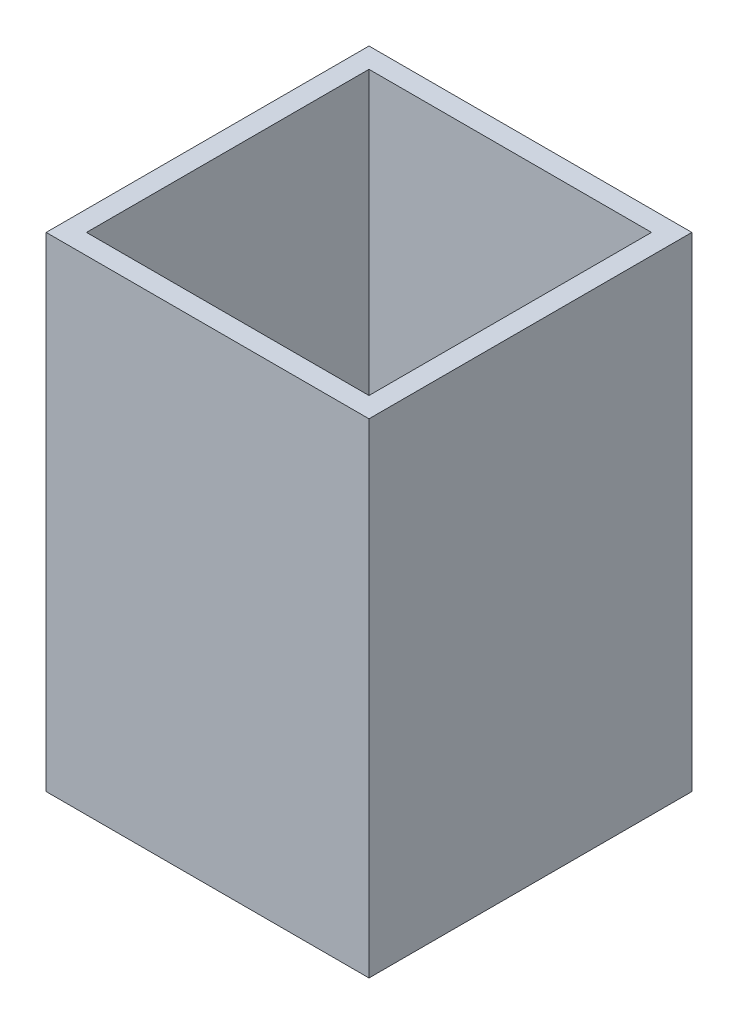
ISO-10303-21;
HEADER;
FILE_DESCRIPTION(('STEP AP214'),'2;1');
FILE_NAME('part.step','',(''),(''),'','','');
FILE_SCHEMA(('AUTOMOTIVE_DESIGN { 1 0 10303 214 1 1 1 1 }'));
ENDSEC;
DATA;
#1=APPLICATION_CONTEXT('core data for automotive mechanical design processes');
#2=APPLICATION_PROTOCOL_DEFINITION('international standard','automotive_design',2000,#1);
#3=PRODUCT_CONTEXT('',#1,'mechanical');
#4=PRODUCT('Part','Part','',(#3));
#5=PRODUCT_RELATED_PRODUCT_CATEGORY('part','',(#4));
#6=PRODUCT_DEFINITION_FORMATION('','',#4);
#7=PRODUCT_DEFINITION_CONTEXT('part definition',#1,'design');
#8=PRODUCT_DEFINITION('design','',#6,#7);
#9=PRODUCT_DEFINITION_SHAPE('','',#8);
#10=(LENGTH_UNIT() NAMED_UNIT(*) SI_UNIT(.MILLI.,.METRE.));
#11=(NAMED_UNIT(*) PLANE_ANGLE_UNIT() SI_UNIT($,.RADIAN.));
#12=(NAMED_UNIT(*) SI_UNIT($,.STERADIAN.) SOLID_ANGLE_UNIT());
#13=UNCERTAINTY_MEASURE_WITH_UNIT(LENGTH_MEASURE(1.E-05),#10,'distance_accuracy_value','');
#14=(GEOMETRIC_REPRESENTATION_CONTEXT(3) GLOBAL_UNCERTAINTY_ASSIGNED_CONTEXT((#13)) GLOBAL_UNIT_ASSIGNED_CONTEXT((#10,
#11,#12)) REPRESENTATION_CONTEXT('',''));
#15=CARTESIAN_POINT('',(0.,0.,0.));
#16=DIRECTION('',(0.,0.,1.));
#17=DIRECTION('',(1.,0.,0.));
#18=AXIS2_PLACEMENT_3D('',#15,#16,#17);
#19=CARTESIAN_POINT('',(90.3275482081614,76.2,23.5625298061409));
#20=DIRECTION('',(0.,-1.,0.));
#21=DIRECTION('',(0.,0.,-1.));
#22=AXIS2_PLACEMENT_3D('',#19,#20,#21);
#23=PLANE('',#22);
#24=DIRECTION('',(0.,0.,-1.));
#25=VECTOR('',#24,1.);
#26=CARTESIAN_POINT('',(90.3275482081614,76.2,-27.2374701938591));
#27=LINE('',#26,#25);
#28=CARTESIAN_POINT('',(90.3275482081614,76.2,23.5625298061409));
#29=VERTEX_POINT('',#28);
#30=CARTESIAN_POINT('',(90.3275482081614,76.2,-27.2374701938591));
#31=VERTEX_POINT('',#30);
#32=EDGE_CURVE('E130',#29,#31,#27,.T.);
#33=ORIENTED_EDGE('',*,*,#32,.T.);
#34=DIRECTION('',(-1.,0.,0.));
#35=VECTOR('',#34,1.);
#36=CARTESIAN_POINT('',(90.3275482081614,76.2,-27.2374701938591));
#37=LINE('',#36,#35);
#38=CARTESIAN_POINT('',(39.5275482081614,76.2,-27.2374701938591));
#39=VERTEX_POINT('',#38);
#40=EDGE_CURVE('E133',#31,#39,#37,.T.);
#41=ORIENTED_EDGE('',*,*,#40,.T.);
#42=DIRECTION('',(0.,0.,1.));
#43=VECTOR('',#42,1.);
#44=CARTESIAN_POINT('',(39.5275482081614,76.2,-27.2374701938591));
#45=LINE('',#44,#43);
#46=CARTESIAN_POINT('',(39.5275482081614,76.2,23.5625298061409));
#47=VERTEX_POINT('',#46);
#48=EDGE_CURVE('E136',#39,#47,#45,.T.);
#49=ORIENTED_EDGE('',*,*,#48,.T.);
#50=DIRECTION('',(1.,0.,0.));
#51=VECTOR('',#50,1.);
#52=CARTESIAN_POINT('',(90.3275482081614,76.2,23.5625298061409));
#53=LINE('',#52,#51);
#54=EDGE_CURVE('E138',#47,#29,#53,.T.);
#55=ORIENTED_EDGE('',*,*,#54,.T.);
#56=EDGE_LOOP('',(#33,#41,#49,#55));
#57=FACE_BOUND('',#56,.T.);
#58=DIRECTION('',(0.,0.,-1.));
#59=VECTOR('',#58,1.);
#60=CARTESIAN_POINT('',(87.1525482081614,76.2,23.5625298061409));
#61=LINE('',#60,#59);
#62=CARTESIAN_POINT('',(87.1525482081614,76.2,20.3875298061409));
#63=VERTEX_POINT('',#62);
#64=CARTESIAN_POINT('',(87.1525482081614,76.2,-24.0624701938591));
#65=VERTEX_POINT('',#64);
#66=EDGE_CURVE('E118',#63,#65,#61,.T.);
#67=ORIENTED_EDGE('',*,*,#66,.F.);
#68=DIRECTION('',(1.,0.,0.));
#69=VECTOR('',#68,1.);
#70=CARTESIAN_POINT('',(90.3275482081614,76.2,20.3875298061409));
#71=LINE('',#70,#69);
#72=CARTESIAN_POINT('',(42.7025482081614,76.2,20.3875298061409));
#73=VERTEX_POINT('',#72);
#74=EDGE_CURVE('E103',#73,#63,#71,.T.);
#75=ORIENTED_EDGE('',*,*,#74,.F.);
#76=DIRECTION('',(0.,0.,1.));
#77=VECTOR('',#76,1.);
#78=CARTESIAN_POINT('',(42.7025482081614,76.2,23.5625298061409));
#79=LINE('',#78,#77);
#80=CARTESIAN_POINT('',(42.7025482081614,76.2,-24.0624701938591));
#81=VERTEX_POINT('',#80);
#82=EDGE_CURVE('E127',#81,#73,#79,.T.);
#83=ORIENTED_EDGE('',*,*,#82,.F.);
#84=DIRECTION('',(-1.,0.,0.));
#85=VECTOR('',#84,1.);
#86=CARTESIAN_POINT('',(90.3275482081614,76.2,-24.0624701938591));
#87=LINE('',#86,#85);
#88=EDGE_CURVE('E120',#65,#81,#87,.T.);
#89=ORIENTED_EDGE('',*,*,#88,.F.);
#90=EDGE_LOOP('',(#67,#75,#83,#89));
#91=FACE_BOUND('',#90,.T.);
#92=ADVANCED_FACE('F33',(#57,#91),#23,.F.);
#93=CARTESIAN_POINT('',(90.3275482081614,0.,23.5625298061409));
#94=DIRECTION('',(0.,-1.,0.));
#95=DIRECTION('',(0.,0.,-1.));
#96=AXIS2_PLACEMENT_3D('',#93,#94,#95);
#97=PLANE('',#96);
#98=DIRECTION('',(0.,0.,-1.));
#99=VECTOR('',#98,1.);
#100=CARTESIAN_POINT('',(90.3275482081614,0.,-27.2374701938591));
#101=LINE('',#100,#99);
#102=CARTESIAN_POINT('',(90.3275482081614,0.,23.5625298061409));
#103=VERTEX_POINT('',#102);
#104=CARTESIAN_POINT('',(90.3275482081614,0.,-27.2374701938591));
#105=VERTEX_POINT('',#104);
#106=EDGE_CURVE('E141',#103,#105,#101,.T.);
#107=ORIENTED_EDGE('',*,*,#106,.F.);
#108=DIRECTION('',(1.,0.,0.));
#109=VECTOR('',#108,1.);
#110=CARTESIAN_POINT('',(90.3275482081614,0.,23.5625298061409));
#111=LINE('',#110,#109);
#112=CARTESIAN_POINT('',(39.5275482081614,0.,23.5625298061409));
#113=VERTEX_POINT('',#112);
#114=EDGE_CURVE('E134',#113,#103,#111,.T.);
#115=ORIENTED_EDGE('',*,*,#114,.F.);
#116=DIRECTION('',(0.,0.,1.));
#117=VECTOR('',#116,1.);
#118=CARTESIAN_POINT('',(39.5275482081614,0.,-27.2374701938591));
#119=LINE('',#118,#117);
#120=CARTESIAN_POINT('',(39.5275482081614,0.,-27.2374701938591));
#121=VERTEX_POINT('',#120);
#122=EDGE_CURVE('E146',#121,#113,#119,.T.);
#123=ORIENTED_EDGE('',*,*,#122,.F.);
#124=DIRECTION('',(-1.,0.,0.));
#125=VECTOR('',#124,1.);
#126=CARTESIAN_POINT('',(90.3275482081614,0.,-27.2374701938591));
#127=LINE('',#126,#125);
#128=EDGE_CURVE('E144',#105,#121,#127,.T.);
#129=ORIENTED_EDGE('',*,*,#128,.F.);
#130=EDGE_LOOP('',(#107,#115,#123,#129));
#131=FACE_BOUND('',#130,.T.);
#132=DIRECTION('',(1.,0.,0.));
#133=VECTOR('',#132,1.);
#134=CARTESIAN_POINT('',(90.3275482081614,0.,20.3875298061409));
#135=LINE('',#134,#133);
#136=CARTESIAN_POINT('',(42.7025482081614,0.,20.3875298061409));
#137=VERTEX_POINT('',#136);
#138=CARTESIAN_POINT('',(87.1525482081614,0.,20.3875298061409));
#139=VERTEX_POINT('',#138);
#140=EDGE_CURVE('E101',#137,#139,#135,.T.);
#141=ORIENTED_EDGE('',*,*,#140,.T.);
#142=DIRECTION('',(0.,0.,-1.));
#143=VECTOR('',#142,1.);
#144=CARTESIAN_POINT('',(87.1525482081614,0.,23.5625298061409));
#145=LINE('',#144,#143);
#146=CARTESIAN_POINT('',(87.1525482081614,0.,-24.0624701938591));
#147=VERTEX_POINT('',#146);
#148=EDGE_CURVE('E109',#139,#147,#145,.T.);
#149=ORIENTED_EDGE('',*,*,#148,.T.);
#150=DIRECTION('',(-1.,0.,0.));
#151=VECTOR('',#150,1.);
#152=CARTESIAN_POINT('',(90.3275482081614,0.,-24.0624701938591));
#153=LINE('',#152,#151);
#154=CARTESIAN_POINT('',(42.7025482081614,0.,-24.0624701938591));
#155=VERTEX_POINT('',#154);
#156=EDGE_CURVE('E115',#147,#155,#153,.T.);
#157=ORIENTED_EDGE('',*,*,#156,.T.);
#158=DIRECTION('',(0.,0.,1.));
#159=VECTOR('',#158,1.);
#160=CARTESIAN_POINT('',(42.7025482081614,0.,23.5625298061409));
#161=LINE('',#160,#159);
#162=EDGE_CURVE('E55',#155,#137,#161,.T.);
#163=ORIENTED_EDGE('',*,*,#162,.T.);
#164=EDGE_LOOP('',(#141,#149,#157,#163));
#165=FACE_BOUND('',#164,.T.);
#166=ADVANCED_FACE('F117',(#131,#165),#97,.T.);
#167=CARTESIAN_POINT('',(90.3275482081614,76.2,-27.2374701938591));
#168=DIRECTION('',(-1.,0.,0.));
#169=DIRECTION('',(0.,0.,1.));
#170=AXIS2_PLACEMENT_3D('',#167,#168,#169);
#171=PLANE('',#170);
#172=ORIENTED_EDGE('',*,*,#106,.T.);
#173=DIRECTION('',(0.,-1.,0.));
#174=VECTOR('',#173,1.);
#175=CARTESIAN_POINT('',(90.3275482081614,76.2,-27.2374701938591));
#176=LINE('',#175,#174);
#177=EDGE_CURVE('E11',#31,#105,#176,.T.);
#178=ORIENTED_EDGE('',*,*,#177,.F.);
#179=ORIENTED_EDGE('',*,*,#32,.F.);
#180=DIRECTION('',(0.,-1.,0.));
#181=VECTOR('',#180,1.);
#182=CARTESIAN_POINT('',(90.3275482081614,76.2,23.5625298061409));
#183=LINE('',#182,#181);
#184=EDGE_CURVE('E140',#29,#103,#183,.T.);
#185=ORIENTED_EDGE('',*,*,#184,.T.);
#186=EDGE_LOOP('',(#172,#178,#179,#185));
#187=FACE_BOUND('',#186,.T.);
#188=ADVANCED_FACE('F35',(#187),#171,.F.);
#189=CARTESIAN_POINT('',(90.3275482081614,76.2,-27.2374701938591));
#190=DIRECTION('',(0.,0.,1.));
#191=DIRECTION('',(1.,0.,0.));
#192=AXIS2_PLACEMENT_3D('',#189,#190,#191);
#193=PLANE('',#192);
#194=ORIENTED_EDGE('',*,*,#128,.T.);
#195=DIRECTION('',(0.,-1.,0.));
#196=VECTOR('',#195,1.);
#197=CARTESIAN_POINT('',(39.5275482081614,76.2,-27.2374701938591));
#198=LINE('',#197,#196);
#199=EDGE_CURVE('E41',#39,#121,#198,.T.);
#200=ORIENTED_EDGE('',*,*,#199,.F.);
#201=ORIENTED_EDGE('',*,*,#40,.F.);
#202=ORIENTED_EDGE('',*,*,#177,.T.);
#203=EDGE_LOOP('',(#194,#200,#201,#202));
#204=FACE_BOUND('',#203,.T.);
#205=ADVANCED_FACE('F173',(#204),#193,.F.);
#206=CARTESIAN_POINT('',(39.5275482081614,76.2,-27.2374701938591));
#207=DIRECTION('',(1.,0.,0.));
#208=DIRECTION('',(0.,0.,-1.));
#209=AXIS2_PLACEMENT_3D('',#206,#207,#208);
#210=PLANE('',#209);
#211=ORIENTED_EDGE('',*,*,#122,.T.);
#212=DIRECTION('',(0.,-1.,0.));
#213=VECTOR('',#212,1.);
#214=CARTESIAN_POINT('',(39.5275482081614,76.2,23.5625298061409));
#215=LINE('',#214,#213);
#216=EDGE_CURVE('E151',#47,#113,#215,.T.);
#217=ORIENTED_EDGE('',*,*,#216,.F.);
#218=ORIENTED_EDGE('',*,*,#48,.F.);
#219=ORIENTED_EDGE('',*,*,#199,.T.);
#220=EDGE_LOOP('',(#211,#217,#218,#219));
#221=FACE_BOUND('',#220,.T.);
#222=ADVANCED_FACE('F158',(#221),#210,.F.);
#223=CARTESIAN_POINT('',(90.3275482081614,76.2,23.5625298061409));
#224=DIRECTION('',(0.,0.,-1.));
#225=DIRECTION('',(-1.,0.,0.));
#226=AXIS2_PLACEMENT_3D('',#223,#224,#225);
#227=PLANE('',#226);
#228=ORIENTED_EDGE('',*,*,#114,.T.);
#229=ORIENTED_EDGE('',*,*,#184,.F.);
#230=ORIENTED_EDGE('',*,*,#54,.F.);
#231=ORIENTED_EDGE('',*,*,#216,.T.);
#232=EDGE_LOOP('',(#228,#229,#230,#231));
#233=FACE_BOUND('',#232,.T.);
#234=ADVANCED_FACE('F166',(#233),#227,.F.);
#235=CARTESIAN_POINT('',(87.1525482081614,76.2,-27.2374701938591));
#236=DIRECTION('',(-1.,0.,0.));
#237=DIRECTION('',(0.,0.,1.));
#238=AXIS2_PLACEMENT_3D('',#235,#236,#237);
#239=PLANE('',#238);
#240=ORIENTED_EDGE('',*,*,#148,.F.);
#241=DIRECTION('',(0.,-1.,0.));
#242=VECTOR('',#241,1.);
#243=CARTESIAN_POINT('',(87.1525482081614,76.2,20.3875298061409));
#244=LINE('',#243,#242);
#245=EDGE_CURVE('E97',#63,#139,#244,.T.);
#246=ORIENTED_EDGE('',*,*,#245,.F.);
#247=ORIENTED_EDGE('',*,*,#66,.T.);
#248=DIRECTION('',(0.,-1.,0.));
#249=VECTOR('',#248,1.);
#250=CARTESIAN_POINT('',(87.1525482081614,76.2,-24.0624701938591));
#251=LINE('',#250,#249);
#252=EDGE_CURVE('E112',#65,#147,#251,.T.);
#253=ORIENTED_EDGE('',*,*,#252,.T.);
#254=EDGE_LOOP('',(#240,#246,#247,#253));
#255=FACE_BOUND('',#254,.T.);
#256=ADVANCED_FACE('F110',(#255),#239,.T.);
#257=CARTESIAN_POINT('',(90.3275482081614,76.2,-24.0624701938591));
#258=DIRECTION('',(0.,0.,1.));
#259=DIRECTION('',(1.,0.,0.));
#260=AXIS2_PLACEMENT_3D('',#257,#258,#259);
#261=PLANE('',#260);
#262=ORIENTED_EDGE('',*,*,#156,.F.);
#263=ORIENTED_EDGE('',*,*,#252,.F.);
#264=ORIENTED_EDGE('',*,*,#88,.T.);
#265=DIRECTION('',(0.,-1.,0.));
#266=VECTOR('',#265,1.);
#267=CARTESIAN_POINT('',(42.7025482081614,76.2,-24.0624701938591));
#268=LINE('',#267,#266);
#269=EDGE_CURVE('E256',#81,#155,#268,.T.);
#270=ORIENTED_EDGE('',*,*,#269,.T.);
#271=EDGE_LOOP('',(#262,#263,#264,#270));
#272=FACE_BOUND('',#271,.T.);
#273=ADVANCED_FACE('F193',(#272),#261,.T.);
#274=CARTESIAN_POINT('',(42.7025482081614,76.2,-27.2374701938591));
#275=DIRECTION('',(1.,0.,0.));
#276=DIRECTION('',(0.,0.,-1.));
#277=AXIS2_PLACEMENT_3D('',#274,#275,#276);
#278=PLANE('',#277);
#279=ORIENTED_EDGE('',*,*,#162,.F.);
#280=ORIENTED_EDGE('',*,*,#269,.F.);
#281=ORIENTED_EDGE('',*,*,#82,.T.);
#282=DIRECTION('',(0.,-1.,0.));
#283=VECTOR('',#282,1.);
#284=CARTESIAN_POINT('',(42.7025482081614,76.2,20.3875298061409));
#285=LINE('',#284,#283);
#286=EDGE_CURVE('E48',#73,#137,#285,.T.);
#287=ORIENTED_EDGE('',*,*,#286,.T.);
#288=EDGE_LOOP('',(#279,#280,#281,#287));
#289=FACE_BOUND('',#288,.T.);
#290=ADVANCED_FACE('F198',(#289),#278,.T.);
#291=CARTESIAN_POINT('',(90.3275482081614,76.2,20.3875298061409));
#292=DIRECTION('',(0.,0.,-1.));
#293=DIRECTION('',(-1.,0.,0.));
#294=AXIS2_PLACEMENT_3D('',#291,#292,#293);
#295=PLANE('',#294);
#296=ORIENTED_EDGE('',*,*,#140,.F.);
#297=ORIENTED_EDGE('',*,*,#286,.F.);
#298=ORIENTED_EDGE('',*,*,#74,.T.);
#299=ORIENTED_EDGE('',*,*,#245,.T.);
#300=EDGE_LOOP('',(#296,#297,#298,#299));
#301=FACE_BOUND('',#300,.T.);
#302=ADVANCED_FACE('F99',(#301),#295,.T.);
#303=CLOSED_SHELL('',(#92,#166,#188,#205,#222,#234,#256,#273,#290,#302));
#304=MANIFOLD_SOLID_BREP('B2',#303);
#305=ADVANCED_BREP_SHAPE_REPRESENTATION('',(#18,#304),#14);
#306=SHAPE_DEFINITION_REPRESENTATION(#9,#305);
ENDSEC;
END-ISO-10303-21;
